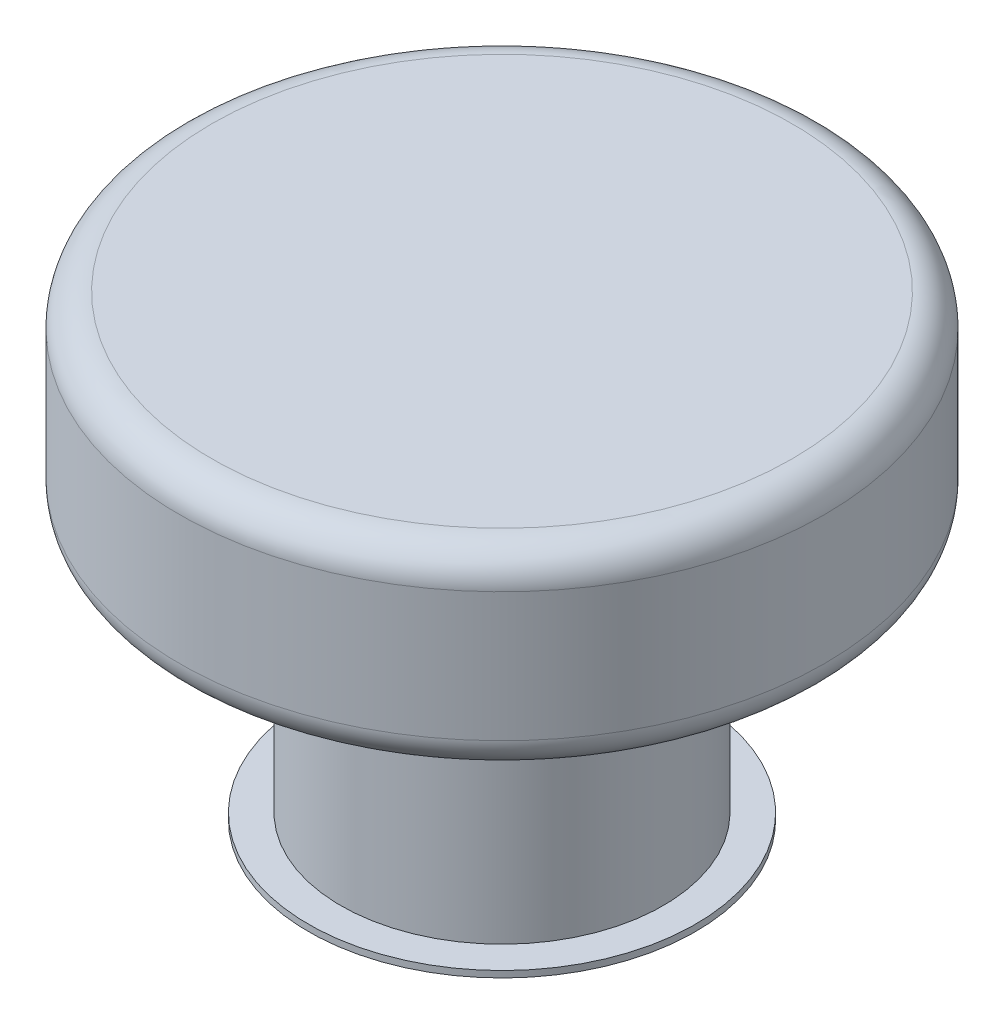
ISO-10303-21;
HEADER;
FILE_DESCRIPTION(('STEP AP214'),'2;1');
FILE_NAME('part.step','',(''),(''),'','','');
FILE_SCHEMA(('AUTOMOTIVE_DESIGN { 1 0 10303 214 1 1 1 1 }'));
ENDSEC;
DATA;
#1=APPLICATION_CONTEXT('core data for automotive mechanical design processes');
#2=APPLICATION_PROTOCOL_DEFINITION('international standard','automotive_design',2000,#1);
#3=PRODUCT_CONTEXT('',#1,'mechanical');
#4=PRODUCT('Part','Part','',(#3));
#5=PRODUCT_RELATED_PRODUCT_CATEGORY('part','',(#4));
#6=PRODUCT_DEFINITION_FORMATION('','',#4);
#7=PRODUCT_DEFINITION_CONTEXT('part definition',#1,'design');
#8=PRODUCT_DEFINITION('design','',#6,#7);
#9=PRODUCT_DEFINITION_SHAPE('','',#8);
#10=(LENGTH_UNIT() NAMED_UNIT(*) SI_UNIT(.MILLI.,.METRE.));
#11=(NAMED_UNIT(*) PLANE_ANGLE_UNIT() SI_UNIT($,.RADIAN.));
#12=(NAMED_UNIT(*) SI_UNIT($,.STERADIAN.) SOLID_ANGLE_UNIT());
#13=UNCERTAINTY_MEASURE_WITH_UNIT(LENGTH_MEASURE(1.E-05),#10,'distance_accuracy_value','');
#14=(GEOMETRIC_REPRESENTATION_CONTEXT(3) GLOBAL_UNCERTAINTY_ASSIGNED_CONTEXT((#13)) GLOBAL_UNIT_ASSIGNED_CONTEXT((#10,
#11,#12)) REPRESENTATION_CONTEXT('',''));
#15=CARTESIAN_POINT('',(0.,0.,0.));
#16=DIRECTION('',(0.,0.,1.));
#17=DIRECTION('',(1.,0.,0.));
#18=AXIS2_PLACEMENT_3D('',#15,#16,#17);
#19=CARTESIAN_POINT('',(0.,0.7,0.));
#20=DIRECTION('',(0.,1.,0.));
#21=DIRECTION('',(-1.,0.,0.));
#22=AXIS2_PLACEMENT_3D('',#19,#20,#21);
#23=CYLINDRICAL_SURFACE('',#22,0.25);
#24=CARTESIAN_POINT('',(0.,0.4,0.));
#25=DIRECTION('',(0.,1.,0.));
#26=DIRECTION('',(-1.,0.,0.));
#27=AXIS2_PLACEMENT_3D('',#24,#25,#26);
#28=CIRCLE('',#27,0.25);
#29=CARTESIAN_POINT('',(-0.25,0.4,0.));
#30=VERTEX_POINT('',#29);
#31=EDGE_CURVE('E67',#30,#30,#28,.T.);
#32=ORIENTED_EDGE('',*,*,#31,.F.);
#33=EDGE_LOOP('',(#32));
#34=FACE_BOUND('',#33,.T.);
#35=CARTESIAN_POINT('',(0.,0.,0.));
#36=DIRECTION('',(0.,1.,0.));
#37=DIRECTION('',(-1.,0.,0.));
#38=AXIS2_PLACEMENT_3D('',#35,#36,#37);
#39=CIRCLE('',#38,0.25);
#40=CARTESIAN_POINT('',(-0.25,0.,0.));
#41=VERTEX_POINT('',#40);
#42=EDGE_CURVE('E68',#41,#41,#39,.T.);
#43=ORIENTED_EDGE('',*,*,#42,.T.);
#44=EDGE_LOOP('',(#43));
#45=FACE_BOUND('',#44,.T.);
#46=ADVANCED_FACE('F43',(#34,#45),#23,.T.);
#47=CARTESIAN_POINT('',(0.25,0.4,0.));
#48=DIRECTION('',(0.,1.,0.));
#49=DIRECTION('',(-1.,0.,0.));
#50=AXIS2_PLACEMENT_3D('',#47,#48,#49);
#51=PLANE('',#50);
#52=CARTESIAN_POINT('',(0.,0.4,0.));
#53=DIRECTION('',(0.,1.,0.));
#54=DIRECTION('',(-1.,0.,0.));
#55=AXIS2_PLACEMENT_3D('',#52,#53,#54);
#56=CIRCLE('',#55,0.45);
#57=CARTESIAN_POINT('',(-0.45,0.4,0.));
#58=VERTEX_POINT('',#57);
#59=EDGE_CURVE('E51',#58,#58,#56,.F.);
#60=ORIENTED_EDGE('',*,*,#59,.T.);
#61=EDGE_LOOP('',(#60));
#62=FACE_BOUND('',#61,.T.);
#63=ORIENTED_EDGE('',*,*,#31,.T.);
#64=EDGE_LOOP('',(#63));
#65=FACE_BOUND('',#64,.T.);
#66=ADVANCED_FACE('F102',(#62,#65),#51,.F.);
#67=CARTESIAN_POINT('',(0.,0.7,0.));
#68=DIRECTION('',(0.,1.,0.));
#69=DIRECTION('',(-1.,0.,0.));
#70=AXIS2_PLACEMENT_3D('',#67,#68,#69);
#71=CYLINDRICAL_SURFACE('',#70,0.5);
#72=CARTESIAN_POINT('',(0.,0.45,0.));
#73=DIRECTION('',(0.,1.,0.));
#74=DIRECTION('',(-1.,0.,0.));
#75=AXIS2_PLACEMENT_3D('',#72,#73,#74);
#76=CIRCLE('',#75,0.5);
#77=CARTESIAN_POINT('',(-0.5,0.45,0.));
#78=VERTEX_POINT('',#77);
#79=EDGE_CURVE('E56',#78,#78,#76,.T.);
#80=ORIENTED_EDGE('',*,*,#79,.T.);
#81=EDGE_LOOP('',(#80));
#82=FACE_BOUND('',#81,.T.);
#83=CARTESIAN_POINT('',(0.,0.65,0.));
#84=DIRECTION('',(0.,-1.,0.));
#85=DIRECTION('',(1.,0.,0.));
#86=AXIS2_PLACEMENT_3D('',#83,#84,#85);
#87=CIRCLE('',#86,0.5);
#88=CARTESIAN_POINT('',(0.5,0.65,0.));
#89=VERTEX_POINT('',#88);
#90=EDGE_CURVE('E61',#89,#89,#87,.T.);
#91=ORIENTED_EDGE('',*,*,#90,.T.);
#92=EDGE_LOOP('',(#91));
#93=FACE_BOUND('',#92,.T.);
#94=ADVANCED_FACE('F108',(#82,#93),#71,.T.);
#95=CARTESIAN_POINT('',(0.5,0.7,0.));
#96=DIRECTION('',(0.,-1.,0.));
#97=DIRECTION('',(1.,0.,0.));
#98=AXIS2_PLACEMENT_3D('',#95,#96,#97);
#99=PLANE('',#98);
#100=CARTESIAN_POINT('',(0.,0.7,0.));
#101=DIRECTION('',(0.,-1.,0.));
#102=DIRECTION('',(1.,0.,0.));
#103=AXIS2_PLACEMENT_3D('',#100,#101,#102);
#104=CIRCLE('',#103,0.45);
#105=CARTESIAN_POINT('',(0.45,0.7,0.));
#106=VERTEX_POINT('',#105);
#107=EDGE_CURVE('E10',#106,#106,#104,.F.);
#108=ORIENTED_EDGE('',*,*,#107,.T.);
#109=EDGE_LOOP('',(#108));
#110=FACE_BOUND('',#109,.T.);
#111=ADVANCED_FACE('F115',(#110),#99,.F.);
#112=CARTESIAN_POINT('',(0.,0.45,0.));
#113=DIRECTION('',(0.,1.,0.));
#114=DIRECTION('',(-1.,0.,0.));
#115=AXIS2_PLACEMENT_3D('',#112,#113,#114);
#116=TOROIDAL_SURFACE('',#115,0.45,0.05);
#117=ORIENTED_EDGE('',*,*,#59,.F.);
#118=EDGE_LOOP('',(#117));
#119=FACE_BOUND('',#118,.T.);
#120=ORIENTED_EDGE('',*,*,#79,.F.);
#121=EDGE_LOOP('',(#120));
#122=FACE_BOUND('',#121,.T.);
#123=ADVANCED_FACE('F113',(#119,#122),#116,.T.);
#124=CARTESIAN_POINT('',(0.,0.65,0.));
#125=DIRECTION('',(0.,-1.,0.));
#126=DIRECTION('',(1.,0.,0.));
#127=AXIS2_PLACEMENT_3D('',#124,#125,#126);
#128=TOROIDAL_SURFACE('',#127,0.45,0.05);
#129=ORIENTED_EDGE('',*,*,#90,.F.);
#130=EDGE_LOOP('',(#129));
#131=FACE_BOUND('',#130,.T.);
#132=ORIENTED_EDGE('',*,*,#107,.F.);
#133=EDGE_LOOP('',(#132));
#134=FACE_BOUND('',#133,.T.);
#135=ADVANCED_FACE('F45',(#131,#134),#128,.T.);
#136=CARTESIAN_POINT('',(0.,-0.01,0.));
#137=DIRECTION('',(0.,1.,0.));
#138=DIRECTION('',(0.,0.,1.));
#139=AXIS2_PLACEMENT_3D('',#136,#137,#138);
#140=CYLINDRICAL_SURFACE('',#139,0.3);
#141=CARTESIAN_POINT('',(0.,-0.01,0.));
#142=DIRECTION('',(0.,-1.,0.));
#143=DIRECTION('',(0.,0.,-1.));
#144=AXIS2_PLACEMENT_3D('',#141,#142,#143);
#145=CIRCLE('',#144,0.3);
#146=CARTESIAN_POINT('',(0.,-0.01,-0.3));
#147=VERTEX_POINT('',#146);
#148=EDGE_CURVE('E72',#147,#147,#145,.T.);
#149=ORIENTED_EDGE('',*,*,#148,.F.);
#150=EDGE_LOOP('',(#149));
#151=FACE_BOUND('',#150,.T.);
#152=CARTESIAN_POINT('',(0.,0.,0.));
#153=DIRECTION('',(0.,-1.,0.));
#154=DIRECTION('',(0.,0.,-1.));
#155=AXIS2_PLACEMENT_3D('',#152,#153,#154);
#156=CIRCLE('',#155,0.3);
#157=CARTESIAN_POINT('',(0.,0.,-0.3));
#158=VERTEX_POINT('',#157);
#159=EDGE_CURVE('E76',#158,#158,#156,.T.);
#160=ORIENTED_EDGE('',*,*,#159,.T.);
#161=EDGE_LOOP('',(#160));
#162=FACE_BOUND('',#161,.T.);
#163=ADVANCED_FACE('F86',(#151,#162),#140,.T.);
#164=CARTESIAN_POINT('',(0.,-0.01,0.));
#165=DIRECTION('',(0.,-1.,0.));
#166=DIRECTION('',(0.,0.,-1.));
#167=AXIS2_PLACEMENT_3D('',#164,#165,#166);
#168=PLANE('',#167);
#169=ORIENTED_EDGE('',*,*,#148,.T.);
#170=EDGE_LOOP('',(#169));
#171=FACE_BOUND('',#170,.T.);
#172=ADVANCED_FACE('F84',(#171),#168,.T.);
#173=CARTESIAN_POINT('',(0.,0.,0.));
#174=DIRECTION('',(0.,-1.,0.));
#175=DIRECTION('',(0.,0.,-1.));
#176=AXIS2_PLACEMENT_3D('',#173,#174,#175);
#177=PLANE('',#176);
#178=ORIENTED_EDGE('',*,*,#42,.F.);
#179=EDGE_LOOP('',(#178));
#180=FACE_BOUND('',#179,.T.);
#181=ORIENTED_EDGE('',*,*,#159,.F.);
#182=EDGE_LOOP('',(#181));
#183=FACE_BOUND('',#182,.T.);
#184=ADVANCED_FACE('F92',(#180,#183),#177,.F.);
#185=CLOSED_SHELL('',(#46,#66,#94,#111,#123,#135,#163,#172,#184));
#186=MANIFOLD_SOLID_BREP('B2',#185);
#187=ADVANCED_BREP_SHAPE_REPRESENTATION('',(#18,#186),#14);
#188=SHAPE_DEFINITION_REPRESENTATION(#9,#187);
ENDSEC;
END-ISO-10303-21;
